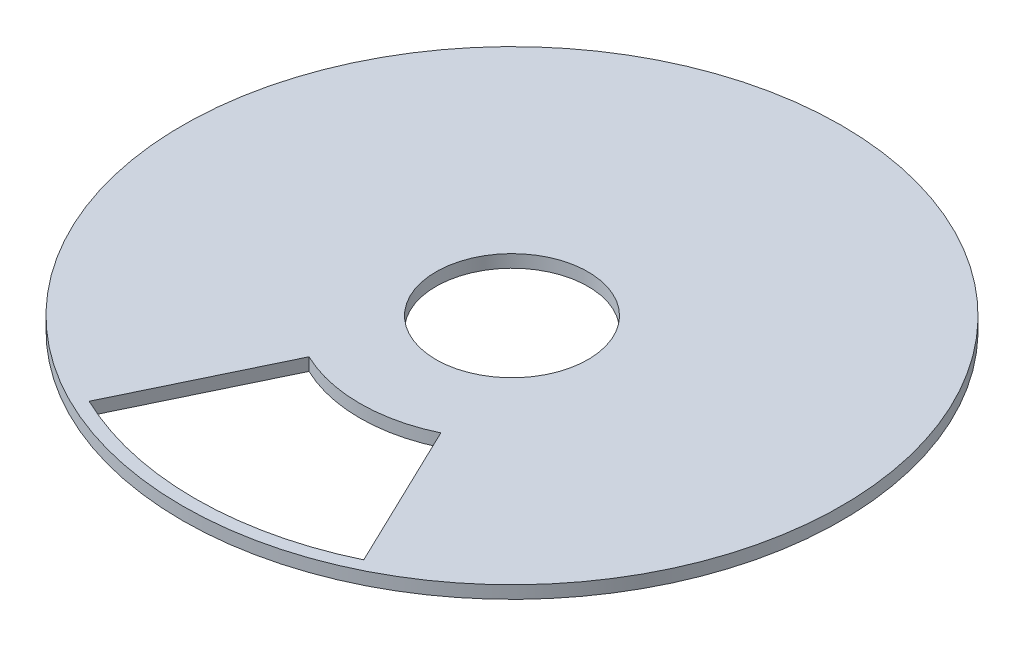
ISO-10303-21;
HEADER;
FILE_DESCRIPTION(('STEP AP214'),'2;1');
FILE_NAME('part.step','',(''),(''),'','','');
FILE_SCHEMA(('AUTOMOTIVE_DESIGN { 1 0 10303 214 1 1 1 1 }'));
ENDSEC;
DATA;
#1=APPLICATION_CONTEXT('core data for automotive mechanical design processes');
#2=APPLICATION_PROTOCOL_DEFINITION('international standard','automotive_design',2000,#1);
#3=PRODUCT_CONTEXT('',#1,'mechanical');
#4=PRODUCT('Part','Part','',(#3));
#5=PRODUCT_RELATED_PRODUCT_CATEGORY('part','',(#4));
#6=PRODUCT_DEFINITION_FORMATION('','',#4);
#7=PRODUCT_DEFINITION_CONTEXT('part definition',#1,'design');
#8=PRODUCT_DEFINITION('design','',#6,#7);
#9=PRODUCT_DEFINITION_SHAPE('','',#8);
#10=(LENGTH_UNIT() NAMED_UNIT(*) SI_UNIT(.MILLI.,.METRE.));
#11=(NAMED_UNIT(*) PLANE_ANGLE_UNIT() SI_UNIT($,.RADIAN.));
#12=(NAMED_UNIT(*) SI_UNIT($,.STERADIAN.) SOLID_ANGLE_UNIT());
#13=UNCERTAINTY_MEASURE_WITH_UNIT(LENGTH_MEASURE(1.E-05),#10,'distance_accuracy_value','');
#14=(GEOMETRIC_REPRESENTATION_CONTEXT(3) GLOBAL_UNCERTAINTY_ASSIGNED_CONTEXT((#13)) GLOBAL_UNIT_ASSIGNED_CONTEXT((#10,
#11,#12)) REPRESENTATION_CONTEXT('',''));
#15=CARTESIAN_POINT('',(0.,0.,0.));
#16=DIRECTION('',(0.,0.,1.));
#17=DIRECTION('',(1.,0.,0.));
#18=AXIS2_PLACEMENT_3D('',#15,#16,#17);
#19=CARTESIAN_POINT('',(0.,6.35,0.));
#20=DIRECTION('',(0.,-1.,0.));
#21=DIRECTION('',(0.,0.,-1.));
#22=AXIS2_PLACEMENT_3D('',#19,#20,#21);
#23=CYLINDRICAL_SURFACE('',#22,165.1);
#24=CARTESIAN_POINT('',(0.,6.35,0.));
#25=DIRECTION('',(0.,1.,0.));
#26=DIRECTION('',(0.,0.,1.));
#27=AXIS2_PLACEMENT_3D('',#24,#25,#26);
#28=CIRCLE('',#27,165.1);
#29=CARTESIAN_POINT('',(0.,6.35,165.1));
#30=VERTEX_POINT('',#29);
#31=EDGE_CURVE('E11',#30,#30,#28,.T.);
#32=ORIENTED_EDGE('',*,*,#31,.F.);
#33=EDGE_LOOP('',(#32));
#34=FACE_BOUND('',#33,.T.);
#35=CARTESIAN_POINT('',(0.,0.,0.));
#36=DIRECTION('',(0.,1.,0.));
#37=DIRECTION('',(0.,0.,1.));
#38=AXIS2_PLACEMENT_3D('',#35,#36,#37);
#39=CIRCLE('',#38,165.1);
#40=CARTESIAN_POINT('',(0.,0.,165.1));
#41=VERTEX_POINT('',#40);
#42=EDGE_CURVE('E42',#41,#41,#39,.T.);
#43=ORIENTED_EDGE('',*,*,#42,.T.);
#44=EDGE_LOOP('',(#43));
#45=FACE_BOUND('',#44,.T.);
#46=ADVANCED_FACE('F39',(#34,#45),#23,.T.);
#47=CARTESIAN_POINT('',(0.,6.35,0.));
#48=DIRECTION('',(0.,1.,0.));
#49=DIRECTION('',(0.,0.,1.));
#50=AXIS2_PLACEMENT_3D('',#47,#48,#49);
#51=PLANE('',#50);
#52=CARTESIAN_POINT('',(0.,6.35,0.));
#53=DIRECTION('',(0.,-1.,0.));
#54=DIRECTION('',(0.,0.,1.));
#55=AXIS2_PLACEMENT_3D('',#52,#53,#54);
#56=CIRCLE('',#55,76.2);
#57=CARTESIAN_POINT('',(33.02,6.35,68.6740096397465));
#58=VERTEX_POINT('',#57);
#59=CARTESIAN_POINT('',(-33.02,6.35,68.6740096397465));
#60=VERTEX_POINT('',#59);
#61=EDGE_CURVE('E53',#58,#60,#56,.T.);
#62=ORIENTED_EDGE('',*,*,#61,.F.);
#63=DIRECTION('',(-0.433333333333333,0.,-0.901233722306385));
#64=VECTOR('',#63,1.);
#65=CARTESIAN_POINT('',(33.02,6.35,68.6740096397465));
#66=LINE('',#65,#64);
#67=CARTESIAN_POINT('',(68.7916666666666,6.35,143.070853416139));
#68=VERTEX_POINT('',#67);
#69=EDGE_CURVE('E97',#68,#58,#66,.T.);
#70=ORIENTED_EDGE('',*,*,#69,.F.);
#71=CARTESIAN_POINT('',(0.,6.35,0.));
#72=DIRECTION('',(0.,1.,0.));
#73=DIRECTION('',(0.,0.,1.));
#74=AXIS2_PLACEMENT_3D('',#71,#72,#73);
#75=CIRCLE('',#74,158.75);
#76=CARTESIAN_POINT('',(-68.7916666666667,6.35,143.070853416139));
#77=VERTEX_POINT('',#76);
#78=EDGE_CURVE('E100',#77,#68,#75,.T.);
#79=ORIENTED_EDGE('',*,*,#78,.F.);
#80=DIRECTION('',(-0.433333333333333,0.,0.901233722306385));
#81=VECTOR('',#80,1.);
#82=CARTESIAN_POINT('',(-33.02,6.35,68.6740096397465));
#83=LINE('',#82,#81);
#84=EDGE_CURVE('E106',#60,#77,#83,.T.);
#85=ORIENTED_EDGE('',*,*,#84,.F.);
#86=EDGE_LOOP('',(#62,#70,#79,#85));
#87=FACE_BOUND('',#86,.T.);
#88=CARTESIAN_POINT('',(0.,6.35,0.));
#89=DIRECTION('',(0.,1.,0.));
#90=DIRECTION('',(0.,0.,1.));
#91=AXIS2_PLACEMENT_3D('',#88,#89,#90);
#92=CIRCLE('',#91,38.1);
#93=CARTESIAN_POINT('',(0.,6.35,38.1));
#94=VERTEX_POINT('',#93);
#95=EDGE_CURVE('E112',#94,#94,#92,.T.);
#96=ORIENTED_EDGE('',*,*,#95,.F.);
#97=EDGE_LOOP('',(#96));
#98=FACE_BOUND('',#97,.T.);
#99=ORIENTED_EDGE('',*,*,#31,.T.);
#100=EDGE_LOOP('',(#99));
#101=FACE_BOUND('',#100,.T.);
#102=ADVANCED_FACE('F124',(#87,#98,#101),#51,.T.);
#103=CARTESIAN_POINT('',(0.,0.,0.));
#104=DIRECTION('',(0.,1.,0.));
#105=DIRECTION('',(0.,0.,1.));
#106=AXIS2_PLACEMENT_3D('',#103,#104,#105);
#107=PLANE('',#106);
#108=DIRECTION('',(-0.433333333333333,0.,-0.901233722306385));
#109=VECTOR('',#108,1.);
#110=CARTESIAN_POINT('',(33.02,0.,68.6740096397465));
#111=LINE('',#110,#109);
#112=CARTESIAN_POINT('',(68.7916666666666,0.,143.070853416139));
#113=VERTEX_POINT('',#112);
#114=CARTESIAN_POINT('',(33.02,0.,68.6740096397465));
#115=VERTEX_POINT('',#114);
#116=EDGE_CURVE('E87',#113,#115,#111,.T.);
#117=ORIENTED_EDGE('',*,*,#116,.T.);
#118=CARTESIAN_POINT('',(0.,0.,0.));
#119=DIRECTION('',(0.,-1.,0.));
#120=DIRECTION('',(0.,0.,1.));
#121=AXIS2_PLACEMENT_3D('',#118,#119,#120);
#122=CIRCLE('',#121,76.2);
#123=CARTESIAN_POINT('',(-33.02,0.,68.6740096397465));
#124=VERTEX_POINT('',#123);
#125=EDGE_CURVE('E81',#115,#124,#122,.T.);
#126=ORIENTED_EDGE('',*,*,#125,.T.);
#127=DIRECTION('',(-0.433333333333333,0.,0.901233722306385));
#128=VECTOR('',#127,1.);
#129=CARTESIAN_POINT('',(-33.02,0.,68.6740096397465));
#130=LINE('',#129,#128);
#131=CARTESIAN_POINT('',(-68.7916666666667,0.,143.070853416139));
#132=VERTEX_POINT('',#131);
#133=EDGE_CURVE('E90',#124,#132,#130,.T.);
#134=ORIENTED_EDGE('',*,*,#133,.T.);
#135=CARTESIAN_POINT('',(0.,0.,0.));
#136=DIRECTION('',(0.,1.,0.));
#137=DIRECTION('',(0.,0.,1.));
#138=AXIS2_PLACEMENT_3D('',#135,#136,#137);
#139=CIRCLE('',#138,158.75);
#140=EDGE_CURVE('E61',#132,#113,#139,.T.);
#141=ORIENTED_EDGE('',*,*,#140,.T.);
#142=EDGE_LOOP('',(#117,#126,#134,#141));
#143=FACE_BOUND('',#142,.T.);
#144=CARTESIAN_POINT('',(0.,0.,0.));
#145=DIRECTION('',(0.,1.,0.));
#146=DIRECTION('',(0.,0.,1.));
#147=AXIS2_PLACEMENT_3D('',#144,#145,#146);
#148=CIRCLE('',#147,38.1);
#149=CARTESIAN_POINT('',(0.,0.,38.1));
#150=VERTEX_POINT('',#149);
#151=EDGE_CURVE('E116',#150,#150,#148,.T.);
#152=ORIENTED_EDGE('',*,*,#151,.T.);
#153=EDGE_LOOP('',(#152));
#154=FACE_BOUND('',#153,.T.);
#155=ORIENTED_EDGE('',*,*,#42,.F.);
#156=EDGE_LOOP('',(#155));
#157=FACE_BOUND('',#156,.T.);
#158=ADVANCED_FACE('F94',(#143,#154,#157),#107,.F.);
#159=CARTESIAN_POINT('',(0.,0.,0.));
#160=DIRECTION('',(0.,1.,0.));
#161=DIRECTION('',(0.,0.,1.));
#162=AXIS2_PLACEMENT_3D('',#159,#160,#161);
#163=CYLINDRICAL_SURFACE('',#162,38.1);
#164=ORIENTED_EDGE('',*,*,#151,.F.);
#165=EDGE_LOOP('',(#164));
#166=FACE_BOUND('',#165,.T.);
#167=ORIENTED_EDGE('',*,*,#95,.T.);
#168=EDGE_LOOP('',(#167));
#169=FACE_BOUND('',#168,.T.);
#170=ADVANCED_FACE('F122',(#166,#169),#163,.F.);
#171=CARTESIAN_POINT('',(0.,0.,0.));
#172=DIRECTION('',(0.,1.,0.));
#173=DIRECTION('',(0.,0.,1.));
#174=AXIS2_PLACEMENT_3D('',#171,#172,#173);
#175=CYLINDRICAL_SURFACE('',#174,76.2);
#176=ORIENTED_EDGE('',*,*,#61,.T.);
#177=DIRECTION('',(0.,1.,0.));
#178=VECTOR('',#177,1.);
#179=CARTESIAN_POINT('',(-33.02,0.,68.6740096397465));
#180=LINE('',#179,#178);
#181=EDGE_CURVE('E77',#124,#60,#180,.T.);
#182=ORIENTED_EDGE('',*,*,#181,.F.);
#183=ORIENTED_EDGE('',*,*,#125,.F.);
#184=DIRECTION('',(0.,1.,0.));
#185=VECTOR('',#184,1.);
#186=CARTESIAN_POINT('',(33.02,0.,68.6740096397465));
#187=LINE('',#186,#185);
#188=EDGE_CURVE('E110',#115,#58,#187,.T.);
#189=ORIENTED_EDGE('',*,*,#188,.T.);
#190=EDGE_LOOP('',(#176,#182,#183,#189));
#191=FACE_BOUND('',#190,.T.);
#192=ADVANCED_FACE('F79',(#191),#175,.T.);
#193=CARTESIAN_POINT('',(33.02,0.,68.6740096397465));
#194=DIRECTION('',(0.901233722306385,0.,-0.433333333333333));
#195=DIRECTION('',(-0.433333333333333,0.,-0.901233722306385));
#196=AXIS2_PLACEMENT_3D('',#193,#194,#195);
#197=PLANE('',#196);
#198=ORIENTED_EDGE('',*,*,#69,.T.);
#199=ORIENTED_EDGE('',*,*,#188,.F.);
#200=ORIENTED_EDGE('',*,*,#116,.F.);
#201=DIRECTION('',(0.,1.,0.));
#202=VECTOR('',#201,1.);
#203=CARTESIAN_POINT('',(68.7916666666666,0.,143.070853416139));
#204=LINE('',#203,#202);
#205=EDGE_CURVE('E113',#113,#68,#204,.T.);
#206=ORIENTED_EDGE('',*,*,#205,.T.);
#207=EDGE_LOOP('',(#198,#199,#200,#206));
#208=FACE_BOUND('',#207,.T.);
#209=ADVANCED_FACE('F146',(#208),#197,.F.);
#210=CARTESIAN_POINT('',(0.,0.,0.));
#211=DIRECTION('',(0.,1.,0.));
#212=DIRECTION('',(0.,0.,1.));
#213=AXIS2_PLACEMENT_3D('',#210,#211,#212);
#214=CYLINDRICAL_SURFACE('',#213,158.75);
#215=ORIENTED_EDGE('',*,*,#78,.T.);
#216=ORIENTED_EDGE('',*,*,#205,.F.);
#217=ORIENTED_EDGE('',*,*,#140,.F.);
#218=DIRECTION('',(0.,1.,0.));
#219=VECTOR('',#218,1.);
#220=CARTESIAN_POINT('',(-68.7916666666667,0.,143.070853416139));
#221=LINE('',#220,#219);
#222=EDGE_CURVE('E86',#132,#77,#221,.T.);
#223=ORIENTED_EDGE('',*,*,#222,.T.);
#224=EDGE_LOOP('',(#215,#216,#217,#223));
#225=FACE_BOUND('',#224,.T.);
#226=ADVANCED_FACE('F149',(#225),#214,.F.);
#227=CARTESIAN_POINT('',(-33.02,0.,68.6740096397465));
#228=DIRECTION('',(-0.901233722306385,0.,-0.433333333333333));
#229=DIRECTION('',(-0.433333333333333,0.,0.901233722306385));
#230=AXIS2_PLACEMENT_3D('',#227,#228,#229);
#231=PLANE('',#230);
#232=ORIENTED_EDGE('',*,*,#84,.T.);
#233=ORIENTED_EDGE('',*,*,#222,.F.);
#234=ORIENTED_EDGE('',*,*,#133,.F.);
#235=ORIENTED_EDGE('',*,*,#181,.T.);
#236=EDGE_LOOP('',(#232,#233,#234,#235));
#237=FACE_BOUND('',#236,.T.);
#238=ADVANCED_FACE('F91',(#237),#231,.F.);
#239=CLOSED_SHELL('',(#46,#102,#158,#170,#192,#209,#226,#238));
#240=MANIFOLD_SOLID_BREP('B2',#239);
#241=ADVANCED_BREP_SHAPE_REPRESENTATION('',(#18,#240),#14);
#242=SHAPE_DEFINITION_REPRESENTATION(#9,#241);
ENDSEC;
END-ISO-10303-21;
